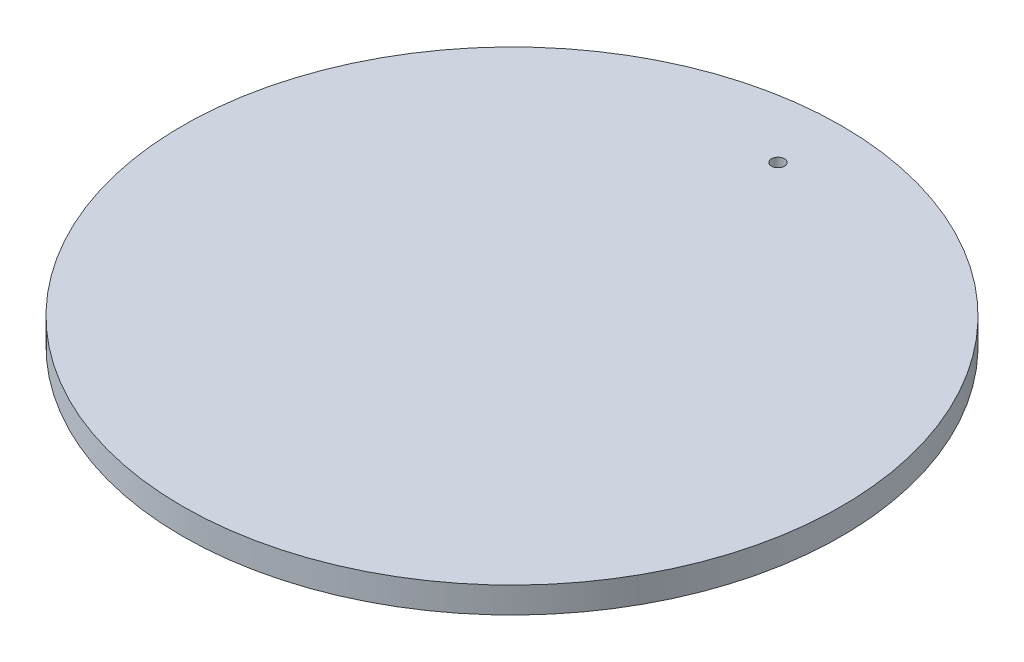
ISO-10303-21;
HEADER;
FILE_DESCRIPTION(('STEP AP214'),'2;1');
FILE_NAME('part.step','',(''),(''),'','','');
FILE_SCHEMA(('AUTOMOTIVE_DESIGN { 1 0 10303 214 1 1 1 1 }'));
ENDSEC;
DATA;
#1=APPLICATION_CONTEXT('core data for automotive mechanical design processes');
#2=APPLICATION_PROTOCOL_DEFINITION('international standard','automotive_design',2000,#1);
#3=PRODUCT_CONTEXT('',#1,'mechanical');
#4=PRODUCT('Part','Part','',(#3));
#5=PRODUCT_RELATED_PRODUCT_CATEGORY('part','',(#4));
#6=PRODUCT_DEFINITION_FORMATION('','',#4);
#7=PRODUCT_DEFINITION_CONTEXT('part definition',#1,'design');
#8=PRODUCT_DEFINITION('design','',#6,#7);
#9=PRODUCT_DEFINITION_SHAPE('','',#8);
#10=(LENGTH_UNIT() NAMED_UNIT(*) SI_UNIT(.MILLI.,.METRE.));
#11=(NAMED_UNIT(*) PLANE_ANGLE_UNIT() SI_UNIT($,.RADIAN.));
#12=(NAMED_UNIT(*) SI_UNIT($,.STERADIAN.) SOLID_ANGLE_UNIT());
#13=UNCERTAINTY_MEASURE_WITH_UNIT(LENGTH_MEASURE(1.E-05),#10,'distance_accuracy_value','');
#14=(GEOMETRIC_REPRESENTATION_CONTEXT(3) GLOBAL_UNCERTAINTY_ASSIGNED_CONTEXT((#13)) GLOBAL_UNIT_ASSIGNED_CONTEXT((#10,
#11,#12)) REPRESENTATION_CONTEXT('',''));
#15=CARTESIAN_POINT('',(0.,0.,0.));
#16=DIRECTION('',(0.,0.,1.));
#17=DIRECTION('',(1.,0.,0.));
#18=AXIS2_PLACEMENT_3D('',#15,#16,#17);
#19=CARTESIAN_POINT('',(0.,1.,0.));
#20=DIRECTION('',(0.,-1.,0.));
#21=DIRECTION('',(0.,0.,-1.));
#22=AXIS2_PLACEMENT_3D('',#19,#20,#21);
#23=CYLINDRICAL_SURFACE('',#22,12.7);
#24=CARTESIAN_POINT('',(0.,1.,0.));
#25=DIRECTION('',(0.,1.,0.));
#26=DIRECTION('',(0.,0.,1.));
#27=AXIS2_PLACEMENT_3D('',#24,#25,#26);
#28=CIRCLE('',#27,12.7);
#29=CARTESIAN_POINT('',(0.,1.,12.7));
#30=VERTEX_POINT('',#29);
#31=EDGE_CURVE('E10',#30,#30,#28,.T.);
#32=ORIENTED_EDGE('',*,*,#31,.F.);
#33=EDGE_LOOP('',(#32));
#34=FACE_BOUND('',#33,.T.);
#35=CARTESIAN_POINT('',(0.,0.,0.));
#36=DIRECTION('',(0.,1.,0.));
#37=DIRECTION('',(0.,0.,1.));
#38=AXIS2_PLACEMENT_3D('',#35,#36,#37);
#39=CIRCLE('',#38,12.7);
#40=CARTESIAN_POINT('',(0.,0.,12.7));
#41=VERTEX_POINT('',#40);
#42=EDGE_CURVE('E38',#41,#41,#39,.T.);
#43=ORIENTED_EDGE('',*,*,#42,.T.);
#44=EDGE_LOOP('',(#43));
#45=FACE_BOUND('',#44,.T.);
#46=ADVANCED_FACE('F35',(#34,#45),#23,.T.);
#47=CARTESIAN_POINT('',(0.,1.,0.));
#48=DIRECTION('',(0.,1.,0.));
#49=DIRECTION('',(0.,0.,1.));
#50=AXIS2_PLACEMENT_3D('',#47,#48,#49);
#51=PLANE('',#50);
#52=CARTESIAN_POINT('',(0.,1.,-10.25));
#53=DIRECTION('',(0.,1.,0.));
#54=DIRECTION('',(0.,0.,1.));
#55=AXIS2_PLACEMENT_3D('',#52,#53,#54);
#56=CIRCLE('',#55,0.25);
#57=CARTESIAN_POINT('',(0.,1.,-10.));
#58=VERTEX_POINT('',#57);
#59=EDGE_CURVE('E45',#58,#58,#56,.T.);
#60=ORIENTED_EDGE('',*,*,#59,.F.);
#61=EDGE_LOOP('',(#60));
#62=FACE_BOUND('',#61,.T.);
#63=ORIENTED_EDGE('',*,*,#31,.T.);
#64=EDGE_LOOP('',(#63));
#65=FACE_BOUND('',#64,.T.);
#66=ADVANCED_FACE('F63',(#62,#65),#51,.T.);
#67=CARTESIAN_POINT('',(0.,0.,0.));
#68=DIRECTION('',(0.,1.,0.));
#69=DIRECTION('',(0.,0.,1.));
#70=AXIS2_PLACEMENT_3D('',#67,#68,#69);
#71=PLANE('',#70);
#72=CARTESIAN_POINT('',(0.,0.,-10.25));
#73=DIRECTION('',(0.,1.,0.));
#74=DIRECTION('',(0.,0.,1.));
#75=AXIS2_PLACEMENT_3D('',#72,#73,#74);
#76=CIRCLE('',#75,0.25);
#77=CARTESIAN_POINT('',(0.,0.,-10.));
#78=VERTEX_POINT('',#77);
#79=EDGE_CURVE('E49',#78,#78,#76,.T.);
#80=ORIENTED_EDGE('',*,*,#79,.T.);
#81=EDGE_LOOP('',(#80));
#82=FACE_BOUND('',#81,.T.);
#83=ORIENTED_EDGE('',*,*,#42,.F.);
#84=EDGE_LOOP('',(#83));
#85=FACE_BOUND('',#84,.T.);
#86=ADVANCED_FACE('F53',(#82,#85),#71,.F.);
#87=CARTESIAN_POINT('',(0.,0.,-10.25));
#88=DIRECTION('',(0.,1.,0.));
#89=DIRECTION('',(0.,0.,1.));
#90=AXIS2_PLACEMENT_3D('',#87,#88,#89);
#91=CYLINDRICAL_SURFACE('',#90,0.25);
#92=ORIENTED_EDGE('',*,*,#59,.T.);
#93=EDGE_LOOP('',(#92));
#94=FACE_BOUND('',#93,.T.);
#95=ORIENTED_EDGE('',*,*,#79,.F.);
#96=EDGE_LOOP('',(#95));
#97=FACE_BOUND('',#96,.T.);
#98=ADVANCED_FACE('F56',(#94,#97),#91,.F.);
#99=CLOSED_SHELL('',(#46,#66,#86,#98));
#100=MANIFOLD_SOLID_BREP('B2',#99);
#101=ADVANCED_BREP_SHAPE_REPRESENTATION('',(#18,#100),#14);
#102=SHAPE_DEFINITION_REPRESENTATION(#9,#101);
ENDSEC;
END-ISO-10303-21;
